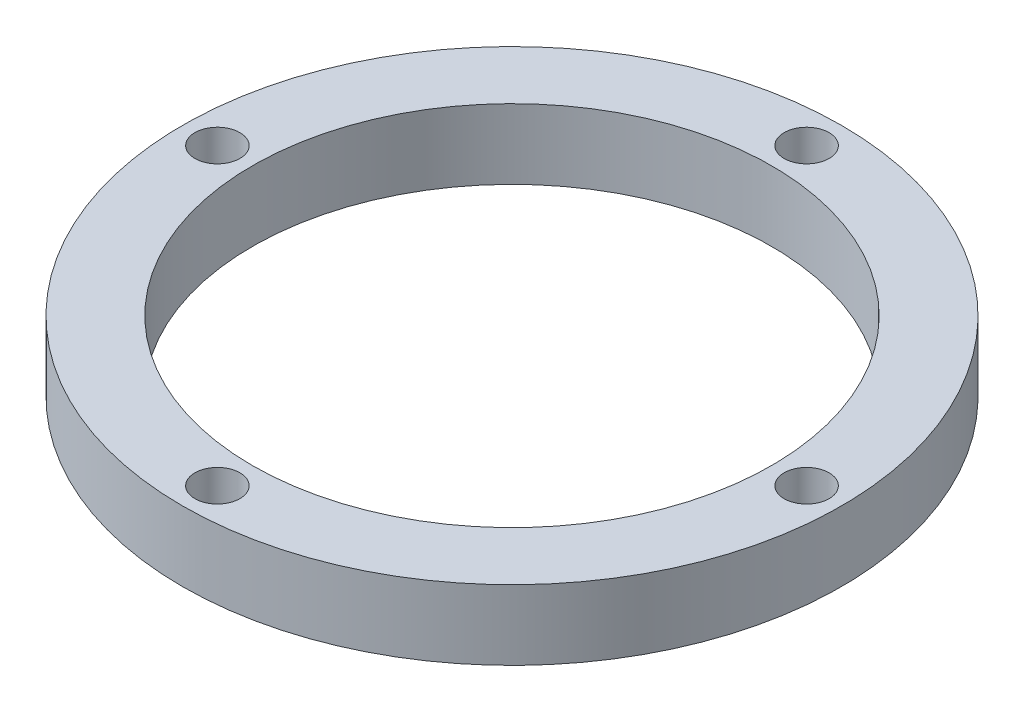
ISO-10303-21;
HEADER;
FILE_DESCRIPTION(('STEP AP214'),'2;1');
FILE_NAME('part.step','',(''),(''),'','','');
FILE_SCHEMA(('AUTOMOTIVE_DESIGN { 1 0 10303 214 1 1 1 1 }'));
ENDSEC;
DATA;
#1=APPLICATION_CONTEXT('core data for automotive mechanical design processes');
#2=APPLICATION_PROTOCOL_DEFINITION('international standard','automotive_design',2000,#1);
#3=PRODUCT_CONTEXT('',#1,'mechanical');
#4=PRODUCT('Part','Part','',(#3));
#5=PRODUCT_RELATED_PRODUCT_CATEGORY('part','',(#4));
#6=PRODUCT_DEFINITION_FORMATION('','',#4);
#7=PRODUCT_DEFINITION_CONTEXT('part definition',#1,'design');
#8=PRODUCT_DEFINITION('design','',#6,#7);
#9=PRODUCT_DEFINITION_SHAPE('','',#8);
#10=(LENGTH_UNIT() NAMED_UNIT(*) SI_UNIT(.MILLI.,.METRE.));
#11=(NAMED_UNIT(*) PLANE_ANGLE_UNIT() SI_UNIT($,.RADIAN.));
#12=(NAMED_UNIT(*) SI_UNIT($,.STERADIAN.) SOLID_ANGLE_UNIT());
#13=UNCERTAINTY_MEASURE_WITH_UNIT(LENGTH_MEASURE(1.E-05),#10,'distance_accuracy_value','');
#14=(GEOMETRIC_REPRESENTATION_CONTEXT(3) GLOBAL_UNCERTAINTY_ASSIGNED_CONTEXT((#13)) GLOBAL_UNIT_ASSIGNED_CONTEXT((#10,
#11,#12)) REPRESENTATION_CONTEXT('',''));
#15=CARTESIAN_POINT('',(0.,0.,0.));
#16=DIRECTION('',(0.,0.,1.));
#17=DIRECTION('',(1.,0.,0.));
#18=AXIS2_PLACEMENT_3D('',#15,#16,#17);
#19=CARTESIAN_POINT('',(0.,7.,0.));
#20=DIRECTION('',(0.,1.,0.));
#21=DIRECTION('',(0.,0.,1.));
#22=AXIS2_PLACEMENT_3D('',#19,#20,#21);
#23=PLANE('',#22);
#24=CARTESIAN_POINT('',(3.08996098487617E-13,7.,-29.5));
#25=DIRECTION('',(0.,1.,0.));
#26=DIRECTION('',(1.,0.,0.));
#27=AXIS2_PLACEMENT_3D('',#24,#25,#26);
#28=CIRCLE('',#27,2.25);
#29=CARTESIAN_POINT('',(2.25000000000031,7.,-29.5));
#30=VERTEX_POINT('',#29);
#31=EDGE_CURVE('E68',#30,#30,#28,.T.);
#32=ORIENTED_EDGE('',*,*,#31,.F.);
#33=EDGE_LOOP('',(#32));
#34=FACE_BOUND('',#33,.T.);
#35=CARTESIAN_POINT('',(-29.5,7.,0.));
#36=DIRECTION('',(0.,1.,0.));
#37=DIRECTION('',(0.,0.,-1.));
#38=AXIS2_PLACEMENT_3D('',#35,#36,#37);
#39=CIRCLE('',#38,2.25);
#40=CARTESIAN_POINT('',(-29.5,7.,-2.25));
#41=VERTEX_POINT('',#40);
#42=EDGE_CURVE('E62',#41,#41,#39,.T.);
#43=ORIENTED_EDGE('',*,*,#42,.F.);
#44=EDGE_LOOP('',(#43));
#45=FACE_BOUND('',#44,.T.);
#46=CARTESIAN_POINT('',(-1.02998699495872E-13,7.,29.5));
#47=DIRECTION('',(0.,1.,0.));
#48=DIRECTION('',(-1.,0.,0.));
#49=AXIS2_PLACEMENT_3D('',#46,#47,#48);
#50=CIRCLE('',#49,2.25);
#51=CARTESIAN_POINT('',(-2.25000000000011,7.,29.5));
#52=VERTEX_POINT('',#51);
#53=EDGE_CURVE('E56',#52,#52,#50,.T.);
#54=ORIENTED_EDGE('',*,*,#53,.F.);
#55=EDGE_LOOP('',(#54));
#56=FACE_BOUND('',#55,.T.);
#57=CARTESIAN_POINT('',(29.5,7.,0.));
#58=DIRECTION('',(0.,1.,0.));
#59=DIRECTION('',(0.,0.,1.));
#60=AXIS2_PLACEMENT_3D('',#57,#58,#59);
#61=CIRCLE('',#60,2.25);
#62=CARTESIAN_POINT('',(29.5,7.,2.25));
#63=VERTEX_POINT('',#62);
#64=EDGE_CURVE('E50',#63,#63,#61,.T.);
#65=ORIENTED_EDGE('',*,*,#64,.F.);
#66=EDGE_LOOP('',(#65));
#67=FACE_BOUND('',#66,.T.);
#68=CARTESIAN_POINT('',(0.,7.,0.));
#69=DIRECTION('',(0.,1.,0.));
#70=DIRECTION('',(0.,0.,1.));
#71=AXIS2_PLACEMENT_3D('',#68,#69,#70);
#72=CIRCLE('',#71,33.);
#73=CARTESIAN_POINT('',(0.,7.,33.));
#74=VERTEX_POINT('',#73);
#75=EDGE_CURVE('E10',#74,#74,#72,.T.);
#76=ORIENTED_EDGE('',*,*,#75,.T.);
#77=EDGE_LOOP('',(#76));
#78=FACE_BOUND('',#77,.T.);
#79=CARTESIAN_POINT('',(0.,7.,0.));
#80=DIRECTION('',(0.,1.,0.));
#81=DIRECTION('',(0.,0.,1.));
#82=AXIS2_PLACEMENT_3D('',#79,#80,#81);
#83=CIRCLE('',#82,26.);
#84=CARTESIAN_POINT('',(0.,7.,26.));
#85=VERTEX_POINT('',#84);
#86=EDGE_CURVE('E42',#85,#85,#83,.T.);
#87=ORIENTED_EDGE('',*,*,#86,.F.);
#88=EDGE_LOOP('',(#87));
#89=FACE_BOUND('',#88,.T.);
#90=ADVANCED_FACE('F31',(#34,#45,#56,#67,#78,#89),#23,.T.);
#91=CARTESIAN_POINT('',(0.,0.,0.));
#92=DIRECTION('',(0.,1.,0.));
#93=DIRECTION('',(0.,0.,1.));
#94=AXIS2_PLACEMENT_3D('',#91,#92,#93);
#95=PLANE('',#94);
#96=CARTESIAN_POINT('',(3.08996098487617E-13,0.,-29.5));
#97=DIRECTION('',(0.,1.,0.));
#98=DIRECTION('',(1.,0.,0.));
#99=AXIS2_PLACEMENT_3D('',#96,#97,#98);
#100=CIRCLE('',#99,2.25);
#101=CARTESIAN_POINT('',(2.25000000000031,0.,-29.5));
#102=VERTEX_POINT('',#101);
#103=EDGE_CURVE('E65',#102,#102,#100,.T.);
#104=ORIENTED_EDGE('',*,*,#103,.T.);
#105=EDGE_LOOP('',(#104));
#106=FACE_BOUND('',#105,.T.);
#107=CARTESIAN_POINT('',(-29.5,0.,0.));
#108=DIRECTION('',(0.,1.,0.));
#109=DIRECTION('',(0.,0.,-1.));
#110=AXIS2_PLACEMENT_3D('',#107,#108,#109);
#111=CIRCLE('',#110,2.25);
#112=CARTESIAN_POINT('',(-29.5,0.,-2.25));
#113=VERTEX_POINT('',#112);
#114=EDGE_CURVE('E59',#113,#113,#111,.T.);
#115=ORIENTED_EDGE('',*,*,#114,.T.);
#116=EDGE_LOOP('',(#115));
#117=FACE_BOUND('',#116,.T.);
#118=CARTESIAN_POINT('',(-1.02998699495872E-13,0.,29.5));
#119=DIRECTION('',(0.,1.,0.));
#120=DIRECTION('',(-1.,0.,0.));
#121=AXIS2_PLACEMENT_3D('',#118,#119,#120);
#122=CIRCLE('',#121,2.25);
#123=CARTESIAN_POINT('',(-2.25000000000011,0.,29.5));
#124=VERTEX_POINT('',#123);
#125=EDGE_CURVE('E53',#124,#124,#122,.T.);
#126=ORIENTED_EDGE('',*,*,#125,.T.);
#127=EDGE_LOOP('',(#126));
#128=FACE_BOUND('',#127,.T.);
#129=CARTESIAN_POINT('',(29.5,0.,0.));
#130=DIRECTION('',(0.,1.,0.));
#131=DIRECTION('',(0.,0.,1.));
#132=AXIS2_PLACEMENT_3D('',#129,#130,#131);
#133=CIRCLE('',#132,2.25);
#134=CARTESIAN_POINT('',(29.5,0.,2.25));
#135=VERTEX_POINT('',#134);
#136=EDGE_CURVE('E47',#135,#135,#133,.T.);
#137=ORIENTED_EDGE('',*,*,#136,.T.);
#138=EDGE_LOOP('',(#137));
#139=FACE_BOUND('',#138,.T.);
#140=CARTESIAN_POINT('',(0.,0.,0.));
#141=DIRECTION('',(0.,1.,0.));
#142=DIRECTION('',(0.,0.,1.));
#143=AXIS2_PLACEMENT_3D('',#140,#141,#142);
#144=CIRCLE('',#143,33.);
#145=CARTESIAN_POINT('',(0.,0.,33.));
#146=VERTEX_POINT('',#145);
#147=EDGE_CURVE('E35',#146,#146,#144,.T.);
#148=ORIENTED_EDGE('',*,*,#147,.F.);
#149=EDGE_LOOP('',(#148));
#150=FACE_BOUND('',#149,.T.);
#151=CARTESIAN_POINT('',(0.,0.,0.));
#152=DIRECTION('',(0.,1.,0.));
#153=DIRECTION('',(0.,0.,1.));
#154=AXIS2_PLACEMENT_3D('',#151,#152,#153);
#155=CIRCLE('',#154,26.);
#156=CARTESIAN_POINT('',(0.,0.,26.));
#157=VERTEX_POINT('',#156);
#158=EDGE_CURVE('E44',#157,#157,#155,.T.);
#159=ORIENTED_EDGE('',*,*,#158,.T.);
#160=EDGE_LOOP('',(#159));
#161=FACE_BOUND('',#160,.T.);
#162=ADVANCED_FACE('F74',(#106,#117,#128,#139,#150,#161),#95,.F.);
#163=CARTESIAN_POINT('',(0.,7.,0.));
#164=DIRECTION('',(0.,-1.,0.));
#165=DIRECTION('',(0.,0.,-1.));
#166=AXIS2_PLACEMENT_3D('',#163,#164,#165);
#167=CYLINDRICAL_SURFACE('',#166,33.);
#168=ORIENTED_EDGE('',*,*,#75,.F.);
#169=EDGE_LOOP('',(#168));
#170=FACE_BOUND('',#169,.T.);
#171=ORIENTED_EDGE('',*,*,#147,.T.);
#172=EDGE_LOOP('',(#171));
#173=FACE_BOUND('',#172,.T.);
#174=ADVANCED_FACE('F33',(#170,#173),#167,.T.);
#175=CARTESIAN_POINT('',(0.,7.,0.));
#176=DIRECTION('',(0.,-1.,0.));
#177=DIRECTION('',(0.,0.,-1.));
#178=AXIS2_PLACEMENT_3D('',#175,#176,#177);
#179=CYLINDRICAL_SURFACE('',#178,26.);
#180=ORIENTED_EDGE('',*,*,#86,.T.);
#181=EDGE_LOOP('',(#180));
#182=FACE_BOUND('',#181,.T.);
#183=ORIENTED_EDGE('',*,*,#158,.F.);
#184=EDGE_LOOP('',(#183));
#185=FACE_BOUND('',#184,.T.);
#186=ADVANCED_FACE('F95',(#182,#185),#179,.F.);
#187=CARTESIAN_POINT('',(29.5,0.,0.));
#188=DIRECTION('',(0.,1.,0.));
#189=DIRECTION('',(0.,0.,1.));
#190=AXIS2_PLACEMENT_3D('',#187,#188,#189);
#191=CYLINDRICAL_SURFACE('',#190,2.25);
#192=ORIENTED_EDGE('',*,*,#136,.F.);
#193=EDGE_LOOP('',(#192));
#194=FACE_BOUND('',#193,.T.);
#195=ORIENTED_EDGE('',*,*,#64,.T.);
#196=EDGE_LOOP('',(#195));
#197=FACE_BOUND('',#196,.T.);
#198=ADVANCED_FACE('F98',(#194,#197),#191,.F.);
#199=CARTESIAN_POINT('',(-1.02998699495872E-13,0.,29.5));
#200=DIRECTION('',(0.,1.,0.));
#201=DIRECTION('',(0.,0.,1.));
#202=AXIS2_PLACEMENT_3D('',#199,#200,#201);
#203=CYLINDRICAL_SURFACE('',#202,2.25);
#204=ORIENTED_EDGE('',*,*,#125,.F.);
#205=EDGE_LOOP('',(#204));
#206=FACE_BOUND('',#205,.T.);
#207=ORIENTED_EDGE('',*,*,#53,.T.);
#208=EDGE_LOOP('',(#207));
#209=FACE_BOUND('',#208,.T.);
#210=ADVANCED_FACE('F110',(#206,#209),#203,.F.);
#211=CARTESIAN_POINT('',(-29.5,0.,0.));
#212=DIRECTION('',(0.,1.,0.));
#213=DIRECTION('',(0.,0.,1.));
#214=AXIS2_PLACEMENT_3D('',#211,#212,#213);
#215=CYLINDRICAL_SURFACE('',#214,2.25);
#216=ORIENTED_EDGE('',*,*,#114,.F.);
#217=EDGE_LOOP('',(#216));
#218=FACE_BOUND('',#217,.T.);
#219=ORIENTED_EDGE('',*,*,#42,.T.);
#220=EDGE_LOOP('',(#219));
#221=FACE_BOUND('',#220,.T.);
#222=ADVANCED_FACE('F80',(#218,#221),#215,.F.);
#223=CARTESIAN_POINT('',(3.08996098487617E-13,0.,-29.5));
#224=DIRECTION('',(0.,1.,0.));
#225=DIRECTION('',(0.,0.,1.));
#226=AXIS2_PLACEMENT_3D('',#223,#224,#225);
#227=CYLINDRICAL_SURFACE('',#226,2.25);
#228=ORIENTED_EDGE('',*,*,#103,.F.);
#229=EDGE_LOOP('',(#228));
#230=FACE_BOUND('',#229,.T.);
#231=ORIENTED_EDGE('',*,*,#31,.T.);
#232=EDGE_LOOP('',(#231));
#233=FACE_BOUND('',#232,.T.);
#234=ADVANCED_FACE('F77',(#230,#233),#227,.F.);
#235=CLOSED_SHELL('',(#90,#162,#174,#186,#198,#210,#222,#234));
#236=MANIFOLD_SOLID_BREP('B2',#235);
#237=ADVANCED_BREP_SHAPE_REPRESENTATION('',(#18,#236),#14);
#238=SHAPE_DEFINITION_REPRESENTATION(#9,#237);
ENDSEC;
END-ISO-10303-21;
